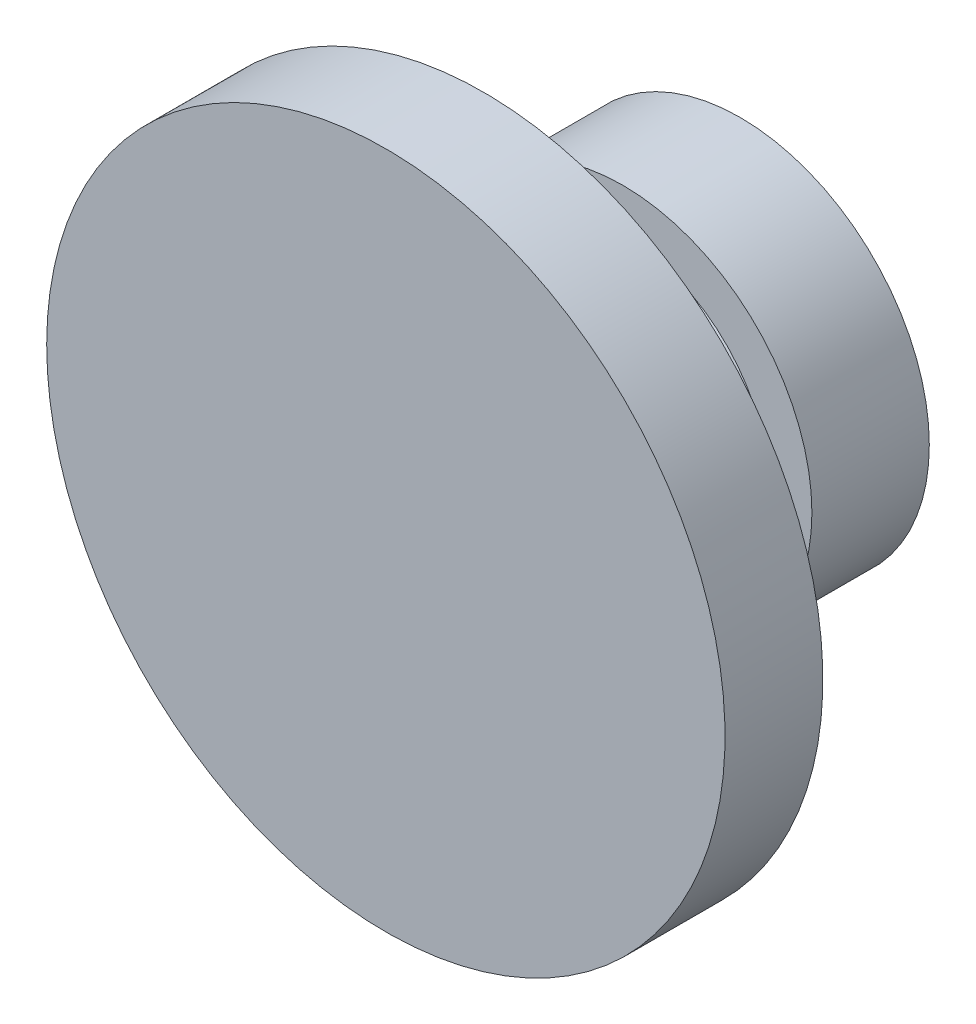
ISO-10303-21;
HEADER;
FILE_DESCRIPTION(('STEP AP214'),'2;1');
FILE_NAME('part.step','',(''),(''),'','','');
FILE_SCHEMA(('AUTOMOTIVE_DESIGN { 1 0 10303 214 1 1 1 1 }'));
ENDSEC;
DATA;
#1=APPLICATION_CONTEXT('core data for automotive mechanical design processes');
#2=APPLICATION_PROTOCOL_DEFINITION('international standard','automotive_design',2000,#1);
#3=PRODUCT_CONTEXT('',#1,'mechanical');
#4=PRODUCT('Part','Part','',(#3));
#5=PRODUCT_RELATED_PRODUCT_CATEGORY('part','',(#4));
#6=PRODUCT_DEFINITION_FORMATION('','',#4);
#7=PRODUCT_DEFINITION_CONTEXT('part definition',#1,'design');
#8=PRODUCT_DEFINITION('design','',#6,#7);
#9=PRODUCT_DEFINITION_SHAPE('','',#8);
#10=(LENGTH_UNIT() NAMED_UNIT(*) SI_UNIT(.MILLI.,.METRE.));
#11=(NAMED_UNIT(*) PLANE_ANGLE_UNIT() SI_UNIT($,.RADIAN.));
#12=(NAMED_UNIT(*) SI_UNIT($,.STERADIAN.) SOLID_ANGLE_UNIT());
#13=UNCERTAINTY_MEASURE_WITH_UNIT(LENGTH_MEASURE(1.E-05),#10,'distance_accuracy_value','');
#14=(GEOMETRIC_REPRESENTATION_CONTEXT(3) GLOBAL_UNCERTAINTY_ASSIGNED_CONTEXT((#13)) GLOBAL_UNIT_ASSIGNED_CONTEXT((#10,
#11,#12)) REPRESENTATION_CONTEXT('',''));
#15=CARTESIAN_POINT('',(0.,0.,0.));
#16=DIRECTION('',(0.,0.,1.));
#17=DIRECTION('',(1.,0.,0.));
#18=AXIS2_PLACEMENT_3D('',#15,#16,#17);
#19=CARTESIAN_POINT('',(1.16643650479244,7.59563085139199,23.1274997720002));
#20=DIRECTION('',(0.,0.,1.));
#21=DIRECTION('',(0.999429657145768,0.0337692229329307,0.));
#22=AXIS2_PLACEMENT_3D('',#19,#20,#21);
#23=PLANE('',#22);
#24=CARTESIAN_POINT('',(-1.80411241501588E-12,-3.33066907387547E-13,23.1274997720002));
#25=DIRECTION('',(0.,0.,-1.));
#26=DIRECTION('',(0.999429657145768,0.0337692229329307,0.));
#27=AXIS2_PLACEMENT_3D('',#24,#25,#26);
#28=CIRCLE('',#27,14.224);
#29=CARTESIAN_POINT('',(14.2158874432396,0.480333426997673,23.1274997720002));
#30=VERTEX_POINT('',#29);
#31=EDGE_CURVE('E19',#30,#30,#28,.T.);
#32=ORIENTED_EDGE('',*,*,#31,.T.);
#33=EDGE_LOOP('',(#32));
#34=FACE_BOUND('',#33,.T.);
#35=CARTESIAN_POINT('',(-1.80411241501588E-12,-3.33066907387547E-13,23.1274997720002));
#36=DIRECTION('',(0.,0.,-1.));
#37=DIRECTION('',(-1.,0.,0.));
#38=AXIS2_PLACEMENT_3D('',#35,#36,#37);
#39=CIRCLE('',#38,18.415);
#40=CARTESIAN_POINT('',(-18.4150000000018,-3.33066907387547E-13,23.1274997720002));
#41=VERTEX_POINT('',#40);
#42=EDGE_CURVE('E43',#41,#41,#39,.F.);
#43=ORIENTED_EDGE('',*,*,#42,.T.);
#44=EDGE_LOOP('',(#43));
#45=FACE_BOUND('',#44,.T.);
#46=ADVANCED_FACE('F15',(#34,#45),#23,.T.);
#47=CARTESIAN_POINT('',(29.792471338383,4.7907563694598,46.1906997720002));
#48=DIRECTION('',(0.,0.,-1.));
#49=DIRECTION('',(-0.999429657145768,-0.0337692229329307,0.));
#50=AXIS2_PLACEMENT_3D('',#47,#48,#49);
#51=PLANE('',#50);
#52=CARTESIAN_POINT('',(-1.80411241501588E-12,-3.33066907387547E-13,46.1906997720002));
#53=DIRECTION('',(0.,0.,1.));
#54=DIRECTION('',(0.999429657145768,0.0337692229329307,0.));
#55=AXIS2_PLACEMENT_3D('',#52,#53,#54);
#56=CIRCLE('',#55,33.02);
#57=CARTESIAN_POINT('',(33.0011672789514,1.11505974124504,46.1906997720002));
#58=VERTEX_POINT('',#57);
#59=EDGE_CURVE('E24',#58,#58,#56,.T.);
#60=ORIENTED_EDGE('',*,*,#59,.T.);
#61=EDGE_LOOP('',(#60));
#62=FACE_BOUND('',#61,.T.);
#63=ADVANCED_FACE('F71',(#62),#51,.F.);
#64=CARTESIAN_POINT('',(29.792471338383,4.7907563694598,36.6656997720002));
#65=DIRECTION('',(0.,0.,-1.));
#66=DIRECTION('',(-0.999429657145768,-0.0337692229329307,0.));
#67=AXIS2_PLACEMENT_3D('',#64,#65,#66);
#68=PLANE('',#67);
#69=CARTESIAN_POINT('',(-1.80411241501588E-12,-3.33066907387547E-13,36.6656997720002));
#70=DIRECTION('',(0.,0.,1.));
#71=DIRECTION('',(0.999429657145768,0.0337692229329307,0.));
#72=AXIS2_PLACEMENT_3D('',#69,#70,#71);
#73=CIRCLE('',#72,33.02);
#74=CARTESIAN_POINT('',(33.0011672789514,1.11505974124504,36.6656997720002));
#75=VERTEX_POINT('',#74);
#76=EDGE_CURVE('E10',#75,#75,#73,.T.);
#77=ORIENTED_EDGE('',*,*,#76,.F.);
#78=EDGE_LOOP('',(#77));
#79=FACE_BOUND('',#78,.T.);
#80=CARTESIAN_POINT('',(-1.80411241501588E-12,-3.33066907387547E-13,36.6656997720002));
#81=DIRECTION('',(0.,0.,1.));
#82=DIRECTION('',(-0.999429657145768,-0.0337692229329307,0.));
#83=AXIS2_PLACEMENT_3D('',#80,#81,#82);
#84=CIRCLE('',#83,14.732);
#85=CARTESIAN_POINT('',(-14.7235977090733,-0.497488192248268,36.6656997720002));
#86=VERTEX_POINT('',#85);
#87=EDGE_CURVE('E33',#86,#86,#84,.T.);
#88=ORIENTED_EDGE('',*,*,#87,.T.);
#89=EDGE_LOOP('',(#88));
#90=FACE_BOUND('',#89,.T.);
#91=ADVANCED_FACE('F75',(#79,#90),#68,.T.);
#92=CARTESIAN_POINT('',(-1.80411241501588E-12,-3.33066907387547E-13,36.6656997720002));
#93=DIRECTION('',(0.,0.,1.));
#94=DIRECTION('',(0.999429657145768,0.0337692229329307,0.));
#95=AXIS2_PLACEMENT_3D('',#92,#93,#94);
#96=CYLINDRICAL_SURFACE('',#95,33.02);
#97=ORIENTED_EDGE('',*,*,#59,.F.);
#98=EDGE_LOOP('',(#97));
#99=FACE_BOUND('',#98,.T.);
#100=ORIENTED_EDGE('',*,*,#76,.T.);
#101=EDGE_LOOP('',(#100));
#102=FACE_BOUND('',#101,.T.);
#103=ADVANCED_FACE('F81',(#99,#102),#96,.T.);
#104=CARTESIAN_POINT('',(-1.80411241501588E-12,-3.33066907387547E-13,75.4604062150189));
#105=DIRECTION('',(0.,0.,-1.));
#106=DIRECTION('',(-0.999429657145768,-0.0337692229329307,0.));
#107=AXIS2_PLACEMENT_3D('',#104,#105,#106);
#108=CYLINDRICAL_SURFACE('',#107,13.716);
#109=CARTESIAN_POINT('',(-1.80411241501588E-12,-3.33066907387547E-13,23.6354997720002));
#110=DIRECTION('',(0.,0.,1.));
#111=DIRECTION('',(0.999429657145768,0.0337692229329307,0.));
#112=AXIS2_PLACEMENT_3D('',#109,#110,#111);
#113=CIRCLE('',#112,13.716);
#114=CARTESIAN_POINT('',(13.7081771774095,0.463178661747744,23.6354997720002));
#115=VERTEX_POINT('',#114);
#116=EDGE_CURVE('E41',#115,#115,#113,.T.);
#117=ORIENTED_EDGE('',*,*,#116,.T.);
#118=EDGE_LOOP('',(#117));
#119=FACE_BOUND('',#118,.T.);
#120=CARTESIAN_POINT('',(-1.80411241501588E-12,-3.33066907387547E-13,35.6496997720002));
#121=DIRECTION('',(0.,0.,-1.));
#122=DIRECTION('',(-0.999429657145768,-0.0337692229329307,0.));
#123=AXIS2_PLACEMENT_3D('',#120,#121,#122);
#124=CIRCLE('',#123,13.716);
#125=CARTESIAN_POINT('',(-13.7081771774132,-0.463178661748411,35.6496997720002));
#126=VERTEX_POINT('',#125);
#127=EDGE_CURVE('E38',#126,#126,#124,.T.);
#128=ORIENTED_EDGE('',*,*,#127,.T.);
#129=EDGE_LOOP('',(#128));
#130=FACE_BOUND('',#129,.T.);
#131=ADVANCED_FACE('F85',(#119,#130),#108,.T.);
#132=CARTESIAN_POINT('',(-1.80411241501588E-12,-3.33066907387547E-13,35.6496997720002));
#133=DIRECTION('',(0.,0.,1.));
#134=DIRECTION('',(0.999429657145768,0.0337692229329307,0.));
#135=AXIS2_PLACEMENT_3D('',#132,#133,#134);
#136=CONICAL_SURFACE('',#135,13.716,0.785398163397438);
#137=ORIENTED_EDGE('',*,*,#87,.F.);
#138=EDGE_LOOP('',(#137));
#139=FACE_BOUND('',#138,.T.);
#140=ORIENTED_EDGE('',*,*,#127,.F.);
#141=EDGE_LOOP('',(#140));
#142=FACE_BOUND('',#141,.T.);
#143=ADVANCED_FACE('F88',(#139,#142),#136,.T.);
#144=CARTESIAN_POINT('',(-1.80411241501588E-12,-3.33066907387547E-13,23.6354997720002));
#145=DIRECTION('',(0.,0.,-1.));
#146=DIRECTION('',(-0.999429657145768,-0.0337692229329307,0.));
#147=AXIS2_PLACEMENT_3D('',#144,#145,#146);
#148=CONICAL_SURFACE('',#147,13.716,0.785398163397434);
#149=ORIENTED_EDGE('',*,*,#31,.F.);
#150=EDGE_LOOP('',(#149));
#151=FACE_BOUND('',#150,.T.);
#152=ORIENTED_EDGE('',*,*,#116,.F.);
#153=EDGE_LOOP('',(#152));
#154=FACE_BOUND('',#153,.T.);
#155=ADVANCED_FACE('F17',(#151,#154),#148,.T.);
#156=CARTESIAN_POINT('',(-1.80411241501588E-12,-3.33066907387547E-13,23.1274997720002));
#157=DIRECTION('',(0.,0.,-1.));
#158=DIRECTION('',(-0.999429657145768,-0.0337692229329307,0.));
#159=AXIS2_PLACEMENT_3D('',#156,#157,#158);
#160=CYLINDRICAL_SURFACE('',#159,18.415);
#161=CARTESIAN_POINT('',(-1.80411241501588E-12,-3.33066907387547E-13,11.6974997720002));
#162=DIRECTION('',(0.,0.,-1.));
#163=DIRECTION('',(-1.,0.,0.));
#164=AXIS2_PLACEMENT_3D('',#161,#162,#163);
#165=CIRCLE('',#164,18.415);
#166=CARTESIAN_POINT('',(-18.4150000000018,-3.33066907387547E-13,11.6974997720002));
#167=VERTEX_POINT('',#166);
#168=EDGE_CURVE('E50',#167,#167,#165,.F.);
#169=ORIENTED_EDGE('',*,*,#168,.T.);
#170=EDGE_LOOP('',(#169));
#171=FACE_BOUND('',#170,.T.);
#172=ORIENTED_EDGE('',*,*,#42,.F.);
#173=EDGE_LOOP('',(#172));
#174=FACE_BOUND('',#173,.T.);
#175=ADVANCED_FACE('F59',(#171,#174),#160,.T.);
#176=CARTESIAN_POINT('',(1.16643650479244,7.59563085139199,11.6974997720002));
#177=DIRECTION('',(0.,0.,1.));
#178=DIRECTION('',(0.999429657145768,0.0337692229329307,0.));
#179=AXIS2_PLACEMENT_3D('',#176,#177,#178);
#180=PLANE('',#179);
#181=ORIENTED_EDGE('',*,*,#168,.F.);
#182=EDGE_LOOP('',(#181));
#183=FACE_BOUND('',#182,.T.);
#184=ADVANCED_FACE('F62',(#183),#180,.F.);
#185=CLOSED_SHELL('',(#46,#63,#91,#103,#131,#143,#155,#175,#184));
#186=MANIFOLD_SOLID_BREP('B1',#185);
#187=ADVANCED_BREP_SHAPE_REPRESENTATION('',(#18,#186),#14);
#188=SHAPE_DEFINITION_REPRESENTATION(#9,#187);
ENDSEC;
END-ISO-10303-21;
